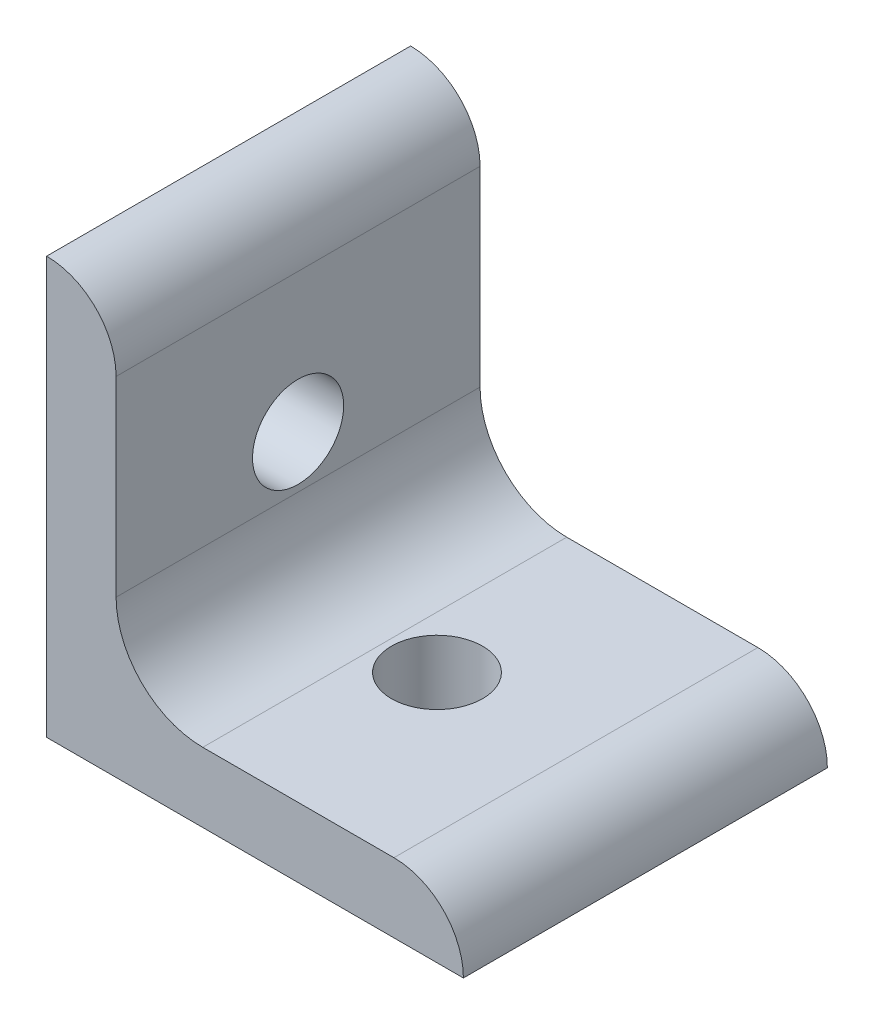
ISO-10303-21;
HEADER;
FILE_DESCRIPTION(('STEP AP214'),'2;1');
FILE_NAME('part.step','',(''),(''),'','','');
FILE_SCHEMA(('AUTOMOTIVE_DESIGN { 1 0 10303 214 1 1 1 1 }'));
ENDSEC;
DATA;
#1=APPLICATION_CONTEXT('core data for automotive mechanical design processes');
#2=APPLICATION_PROTOCOL_DEFINITION('international standard','automotive_design',2000,#1);
#3=PRODUCT_CONTEXT('',#1,'mechanical');
#4=PRODUCT('Part','Part','',(#3));
#5=PRODUCT_RELATED_PRODUCT_CATEGORY('part','',(#4));
#6=PRODUCT_DEFINITION_FORMATION('','',#4);
#7=PRODUCT_DEFINITION_CONTEXT('part definition',#1,'design');
#8=PRODUCT_DEFINITION('design','',#6,#7);
#9=PRODUCT_DEFINITION_SHAPE('','',#8);
#10=(LENGTH_UNIT() NAMED_UNIT(*) SI_UNIT(.MILLI.,.METRE.));
#11=(NAMED_UNIT(*) PLANE_ANGLE_UNIT() SI_UNIT($,.RADIAN.));
#12=(NAMED_UNIT(*) SI_UNIT($,.STERADIAN.) SOLID_ANGLE_UNIT());
#13=UNCERTAINTY_MEASURE_WITH_UNIT(LENGTH_MEASURE(1.E-05),#10,'distance_accuracy_value','');
#14=(GEOMETRIC_REPRESENTATION_CONTEXT(3) GLOBAL_UNCERTAINTY_ASSIGNED_CONTEXT((#13)) GLOBAL_UNIT_ASSIGNED_CONTEXT((#10,
#11,#12)) REPRESENTATION_CONTEXT('',''));
#15=CARTESIAN_POINT('',(0.,0.,0.));
#16=DIRECTION('',(0.,0.,1.));
#17=DIRECTION('',(1.,0.,0.));
#18=AXIS2_PLACEMENT_3D('',#15,#16,#17);
#19=CARTESIAN_POINT('',(-19.05,12.7,16.637));
#20=DIRECTION('',(0.,0.,-1.));
#21=DIRECTION('',(-1.,0.,0.));
#22=AXIS2_PLACEMENT_3D('',#19,#20,#21);
#23=CYLINDRICAL_SURFACE('',#22,6.35);
#24=DIRECTION('',(0.,0.,-1.));
#25=VECTOR('',#24,1.);
#26=CARTESIAN_POINT('',(-12.7,12.7,16.637));
#27=LINE('',#26,#25);
#28=CARTESIAN_POINT('',(-12.7,12.7,16.637));
#29=VERTEX_POINT('',#28);
#30=CARTESIAN_POINT('',(-12.7,12.7,-16.637));
#31=VERTEX_POINT('',#30);
#32=EDGE_CURVE('E110',#29,#31,#27,.T.);
#33=ORIENTED_EDGE('',*,*,#32,.T.);
#34=CARTESIAN_POINT('',(-19.05,12.7,-16.637));
#35=DIRECTION('',(0.,0.,1.));
#36=DIRECTION('',(1.,0.,0.));
#37=AXIS2_PLACEMENT_3D('',#34,#35,#36);
#38=CIRCLE('',#37,6.35);
#39=CARTESIAN_POINT('',(-19.05,19.05,-16.637));
#40=VERTEX_POINT('',#39);
#41=EDGE_CURVE('E104',#31,#40,#38,.T.);
#42=ORIENTED_EDGE('',*,*,#41,.T.);
#43=DIRECTION('',(0.,0.,-1.));
#44=VECTOR('',#43,1.);
#45=CARTESIAN_POINT('',(-19.05,19.05,16.637));
#46=LINE('',#45,#44);
#47=CARTESIAN_POINT('',(-19.05,19.05,16.637));
#48=VERTEX_POINT('',#47);
#49=EDGE_CURVE('E11',#48,#40,#46,.T.);
#50=ORIENTED_EDGE('',*,*,#49,.F.);
#51=CARTESIAN_POINT('',(-19.05,12.7,16.637));
#52=DIRECTION('',(0.,0.,1.));
#53=DIRECTION('',(1.,0.,0.));
#54=AXIS2_PLACEMENT_3D('',#51,#52,#53);
#55=CIRCLE('',#54,6.35);
#56=EDGE_CURVE('E130',#29,#48,#55,.T.);
#57=ORIENTED_EDGE('',*,*,#56,.F.);
#58=EDGE_LOOP('',(#33,#42,#50,#57));
#59=FACE_BOUND('',#58,.T.);
#60=ADVANCED_FACE('F32',(#59),#23,.T.);
#61=CARTESIAN_POINT('',(-19.05,19.05,16.637));
#62=DIRECTION('',(1.,0.,0.));
#63=DIRECTION('',(0.,1.,0.));
#64=AXIS2_PLACEMENT_3D('',#61,#62,#63);
#65=PLANE('',#64);
#66=CARTESIAN_POINT('',(-19.05,0.,0.));
#67=DIRECTION('',(1.,0.,0.));
#68=DIRECTION('',(0.,0.,-1.));
#69=AXIS2_PLACEMENT_3D('',#66,#67,#68);
#70=CIRCLE('',#69,4.1656);
#71=CARTESIAN_POINT('',(-19.05,0.,-4.1656));
#72=VERTEX_POINT('',#71);
#73=EDGE_CURVE('E213',#72,#72,#70,.T.);
#74=ORIENTED_EDGE('',*,*,#73,.T.);
#75=EDGE_LOOP('',(#74));
#76=FACE_BOUND('',#75,.T.);
#77=ORIENTED_EDGE('',*,*,#49,.T.);
#78=DIRECTION('',(0.,-1.,0.));
#79=VECTOR('',#78,1.);
#80=CARTESIAN_POINT('',(-19.05,19.05,-16.637));
#81=LINE('',#80,#79);
#82=CARTESIAN_POINT('',(-19.05,-19.05,-16.637));
#83=VERTEX_POINT('',#82);
#84=EDGE_CURVE('E94',#40,#83,#81,.T.);
#85=ORIENTED_EDGE('',*,*,#84,.T.);
#86=DIRECTION('',(0.,0.,-1.));
#87=VECTOR('',#86,1.);
#88=CARTESIAN_POINT('',(-19.05,-19.05,16.637));
#89=LINE('',#88,#87);
#90=CARTESIAN_POINT('',(-19.05,-19.05,16.637));
#91=VERTEX_POINT('',#90);
#92=EDGE_CURVE('E40',#91,#83,#89,.T.);
#93=ORIENTED_EDGE('',*,*,#92,.F.);
#94=DIRECTION('',(0.,-1.,0.));
#95=VECTOR('',#94,1.);
#96=CARTESIAN_POINT('',(-19.05,19.05,16.637));
#97=LINE('',#96,#95);
#98=EDGE_CURVE('E95',#48,#91,#97,.T.);
#99=ORIENTED_EDGE('',*,*,#98,.F.);
#100=EDGE_LOOP('',(#77,#85,#93,#99));
#101=FACE_BOUND('',#100,.T.);
#102=ADVANCED_FACE('F92',(#76,#101),#65,.F.);
#103=CARTESIAN_POINT('',(-19.05,-19.05,16.637));
#104=DIRECTION('',(0.,1.,0.));
#105=DIRECTION('',(0.,0.,1.));
#106=AXIS2_PLACEMENT_3D('',#103,#104,#105);
#107=PLANE('',#106);
#108=CARTESIAN_POINT('',(0.,-19.05,0.));
#109=DIRECTION('',(0.,1.,0.));
#110=DIRECTION('',(0.,0.,1.));
#111=AXIS2_PLACEMENT_3D('',#108,#109,#110);
#112=CIRCLE('',#111,4.1656);
#113=CARTESIAN_POINT('',(0.,-19.05,4.1656));
#114=VERTEX_POINT('',#113);
#115=EDGE_CURVE('E114',#114,#114,#112,.T.);
#116=ORIENTED_EDGE('',*,*,#115,.T.);
#117=EDGE_LOOP('',(#116));
#118=FACE_BOUND('',#117,.T.);
#119=ORIENTED_EDGE('',*,*,#92,.T.);
#120=DIRECTION('',(1.,0.,0.));
#121=VECTOR('',#120,1.);
#122=CARTESIAN_POINT('',(-19.05,-19.05,-16.637));
#123=LINE('',#122,#121);
#124=CARTESIAN_POINT('',(19.05,-19.05,-16.637));
#125=VERTEX_POINT('',#124);
#126=EDGE_CURVE('E108',#83,#125,#123,.T.);
#127=ORIENTED_EDGE('',*,*,#126,.T.);
#128=DIRECTION('',(0.,0.,-1.));
#129=VECTOR('',#128,1.);
#130=CARTESIAN_POINT('',(19.05,-19.05,16.637));
#131=LINE('',#130,#129);
#132=CARTESIAN_POINT('',(19.05,-19.05,16.637));
#133=VERTEX_POINT('',#132);
#134=EDGE_CURVE('E148',#133,#125,#131,.T.);
#135=ORIENTED_EDGE('',*,*,#134,.F.);
#136=DIRECTION('',(1.,0.,0.));
#137=VECTOR('',#136,1.);
#138=CARTESIAN_POINT('',(-19.05,-19.05,16.637));
#139=LINE('',#138,#137);
#140=EDGE_CURVE('E133',#91,#133,#139,.T.);
#141=ORIENTED_EDGE('',*,*,#140,.F.);
#142=EDGE_LOOP('',(#119,#127,#135,#141));
#143=FACE_BOUND('',#142,.T.);
#144=ADVANCED_FACE('F152',(#118,#143),#107,.F.);
#145=CARTESIAN_POINT('',(12.7,-19.05,16.637));
#146=DIRECTION('',(0.,0.,-1.));
#147=DIRECTION('',(-1.,0.,0.));
#148=AXIS2_PLACEMENT_3D('',#145,#146,#147);
#149=CYLINDRICAL_SURFACE('',#148,6.35);
#150=ORIENTED_EDGE('',*,*,#134,.T.);
#151=CARTESIAN_POINT('',(12.7,-19.05,-16.637));
#152=DIRECTION('',(0.,0.,1.));
#153=DIRECTION('',(-1.,0.,0.));
#154=AXIS2_PLACEMENT_3D('',#151,#152,#153);
#155=CIRCLE('',#154,6.35);
#156=CARTESIAN_POINT('',(12.7,-12.7,-16.637));
#157=VERTEX_POINT('',#156);
#158=EDGE_CURVE('E119',#125,#157,#155,.T.);
#159=ORIENTED_EDGE('',*,*,#158,.T.);
#160=DIRECTION('',(0.,0.,-1.));
#161=VECTOR('',#160,1.);
#162=CARTESIAN_POINT('',(12.7,-12.7,16.637));
#163=LINE('',#162,#161);
#164=CARTESIAN_POINT('',(12.7,-12.7,16.637));
#165=VERTEX_POINT('',#164);
#166=EDGE_CURVE('E146',#165,#157,#163,.T.);
#167=ORIENTED_EDGE('',*,*,#166,.F.);
#168=CARTESIAN_POINT('',(12.7,-19.05,16.637));
#169=DIRECTION('',(0.,0.,1.));
#170=DIRECTION('',(-1.,0.,0.));
#171=AXIS2_PLACEMENT_3D('',#168,#169,#170);
#172=CIRCLE('',#171,6.35);
#173=EDGE_CURVE('E135',#133,#165,#172,.T.);
#174=ORIENTED_EDGE('',*,*,#173,.F.);
#175=EDGE_LOOP('',(#150,#159,#167,#174));
#176=FACE_BOUND('',#175,.T.);
#177=ADVANCED_FACE('F160',(#176),#149,.T.);
#178=CARTESIAN_POINT('',(-4.77519999999995,-12.7,16.637));
#179=DIRECTION('',(0.,-1.,0.));
#180=DIRECTION('',(0.,0.,-1.));
#181=AXIS2_PLACEMENT_3D('',#178,#179,#180);
#182=PLANE('',#181);
#183=CARTESIAN_POINT('',(0.,-12.7,0.));
#184=DIRECTION('',(0.,-1.,0.));
#185=DIRECTION('',(0.,0.,-1.));
#186=AXIS2_PLACEMENT_3D('',#183,#184,#185);
#187=CIRCLE('',#186,4.1656);
#188=CARTESIAN_POINT('',(0.,-12.7,4.1656));
#189=VERTEX_POINT('',#188);
#190=EDGE_CURVE('E111',#189,#189,#187,.T.);
#191=ORIENTED_EDGE('',*,*,#190,.T.);
#192=EDGE_LOOP('',(#191));
#193=FACE_BOUND('',#192,.T.);
#194=ORIENTED_EDGE('',*,*,#166,.T.);
#195=DIRECTION('',(-1.,0.,0.));
#196=VECTOR('',#195,1.);
#197=CARTESIAN_POINT('',(-4.77519999999995,-12.7,-16.637));
#198=LINE('',#197,#196);
#199=CARTESIAN_POINT('',(-4.77519999999995,-12.7,-16.637));
#200=VERTEX_POINT('',#199);
#201=EDGE_CURVE('E122',#157,#200,#198,.T.);
#202=ORIENTED_EDGE('',*,*,#201,.T.);
#203=DIRECTION('',(0.,0.,-1.));
#204=VECTOR('',#203,1.);
#205=CARTESIAN_POINT('',(-4.77519999999995,-12.7,16.637));
#206=LINE('',#205,#204);
#207=CARTESIAN_POINT('',(-4.77519999999995,-12.7,16.637));
#208=VERTEX_POINT('',#207);
#209=EDGE_CURVE('E144',#208,#200,#206,.T.);
#210=ORIENTED_EDGE('',*,*,#209,.F.);
#211=DIRECTION('',(-1.,0.,0.));
#212=VECTOR('',#211,1.);
#213=CARTESIAN_POINT('',(-4.77519999999995,-12.7,16.637));
#214=LINE('',#213,#212);
#215=EDGE_CURVE('E137',#165,#208,#214,.T.);
#216=ORIENTED_EDGE('',*,*,#215,.F.);
#217=EDGE_LOOP('',(#194,#202,#210,#216));
#218=FACE_BOUND('',#217,.T.);
#219=ADVANCED_FACE('F163',(#193,#218),#182,.F.);
#220=CARTESIAN_POINT('',(-4.7752,-4.7752,16.637));
#221=DIRECTION('',(0.,0.,-1.));
#222=DIRECTION('',(-1.,0.,0.));
#223=AXIS2_PLACEMENT_3D('',#220,#221,#222);
#224=CYLINDRICAL_SURFACE('',#223,7.9248);
#225=ORIENTED_EDGE('',*,*,#209,.T.);
#226=CARTESIAN_POINT('',(-4.7752,-4.7752,-16.637));
#227=DIRECTION('',(0.,0.,-1.));
#228=DIRECTION('',(1.,0.,0.));
#229=AXIS2_PLACEMENT_3D('',#226,#227,#228);
#230=CIRCLE('',#229,7.9248);
#231=CARTESIAN_POINT('',(-12.7,-4.77519999999994,-16.637));
#232=VERTEX_POINT('',#231);
#233=EDGE_CURVE('E125',#200,#232,#230,.T.);
#234=ORIENTED_EDGE('',*,*,#233,.T.);
#235=DIRECTION('',(0.,0.,-1.));
#236=VECTOR('',#235,1.);
#237=CARTESIAN_POINT('',(-12.7,-4.77519999999994,16.637));
#238=LINE('',#237,#236);
#239=CARTESIAN_POINT('',(-12.7,-4.77519999999994,16.637));
#240=VERTEX_POINT('',#239);
#241=EDGE_CURVE('E142',#240,#232,#238,.T.);
#242=ORIENTED_EDGE('',*,*,#241,.F.);
#243=CARTESIAN_POINT('',(-4.7752,-4.7752,16.637));
#244=DIRECTION('',(0.,0.,-1.));
#245=DIRECTION('',(1.,0.,0.));
#246=AXIS2_PLACEMENT_3D('',#243,#244,#245);
#247=CIRCLE('',#246,7.9248);
#248=EDGE_CURVE('E53',#208,#240,#247,.T.);
#249=ORIENTED_EDGE('',*,*,#248,.F.);
#250=EDGE_LOOP('',(#225,#234,#242,#249));
#251=FACE_BOUND('',#250,.T.);
#252=ADVANCED_FACE('F166',(#251),#224,.F.);
#253=CARTESIAN_POINT('',(-12.7,12.7,16.637));
#254=DIRECTION('',(-1.,0.,0.));
#255=DIRECTION('',(0.,-1.,0.));
#256=AXIS2_PLACEMENT_3D('',#253,#254,#255);
#257=PLANE('',#256);
#258=CARTESIAN_POINT('',(-12.7,0.,0.));
#259=DIRECTION('',(-1.,0.,0.));
#260=DIRECTION('',(0.,-1.,0.));
#261=AXIS2_PLACEMENT_3D('',#258,#259,#260);
#262=CIRCLE('',#261,4.1656);
#263=CARTESIAN_POINT('',(-12.7,-4.1656,0.));
#264=VERTEX_POINT('',#263);
#265=EDGE_CURVE('E35',#264,#264,#262,.T.);
#266=ORIENTED_EDGE('',*,*,#265,.T.);
#267=EDGE_LOOP('',(#266));
#268=FACE_BOUND('',#267,.T.);
#269=ORIENTED_EDGE('',*,*,#241,.T.);
#270=DIRECTION('',(0.,1.,0.));
#271=VECTOR('',#270,1.);
#272=CARTESIAN_POINT('',(-12.7,12.7,-16.637));
#273=LINE('',#272,#271);
#274=EDGE_CURVE('E128',#232,#31,#273,.T.);
#275=ORIENTED_EDGE('',*,*,#274,.T.);
#276=ORIENTED_EDGE('',*,*,#32,.F.);
#277=DIRECTION('',(0.,1.,0.));
#278=VECTOR('',#277,1.);
#279=CARTESIAN_POINT('',(-12.7,12.7,16.637));
#280=LINE('',#279,#278);
#281=EDGE_CURVE('E48',#240,#29,#280,.T.);
#282=ORIENTED_EDGE('',*,*,#281,.F.);
#283=EDGE_LOOP('',(#269,#275,#276,#282));
#284=FACE_BOUND('',#283,.T.);
#285=ADVANCED_FACE('F168',(#268,#284),#257,.F.);
#286=CARTESIAN_POINT('',(-19.05,12.7,16.637));
#287=DIRECTION('',(0.,0.,1.));
#288=DIRECTION('',(1.,0.,0.));
#289=AXIS2_PLACEMENT_3D('',#286,#287,#288);
#290=PLANE('',#289);
#291=ORIENTED_EDGE('',*,*,#56,.T.);
#292=ORIENTED_EDGE('',*,*,#98,.T.);
#293=ORIENTED_EDGE('',*,*,#140,.T.);
#294=ORIENTED_EDGE('',*,*,#173,.T.);
#295=ORIENTED_EDGE('',*,*,#215,.T.);
#296=ORIENTED_EDGE('',*,*,#248,.T.);
#297=ORIENTED_EDGE('',*,*,#281,.T.);
#298=EDGE_LOOP('',(#291,#292,#293,#294,#295,#296,#297));
#299=FACE_BOUND('',#298,.T.);
#300=ADVANCED_FACE('F155',(#299),#290,.T.);
#301=CARTESIAN_POINT('',(-19.05,12.7,-16.637));
#302=DIRECTION('',(0.,0.,1.));
#303=DIRECTION('',(1.,0.,0.));
#304=AXIS2_PLACEMENT_3D('',#301,#302,#303);
#305=PLANE('',#304);
#306=ORIENTED_EDGE('',*,*,#41,.F.);
#307=ORIENTED_EDGE('',*,*,#274,.F.);
#308=ORIENTED_EDGE('',*,*,#233,.F.);
#309=ORIENTED_EDGE('',*,*,#201,.F.);
#310=ORIENTED_EDGE('',*,*,#158,.F.);
#311=ORIENTED_EDGE('',*,*,#126,.F.);
#312=ORIENTED_EDGE('',*,*,#84,.F.);
#313=EDGE_LOOP('',(#306,#307,#308,#309,#310,#311,#312));
#314=FACE_BOUND('',#313,.T.);
#315=ADVANCED_FACE('F102',(#314),#305,.F.);
#316=CARTESIAN_POINT('',(0.,-19.05,0.));
#317=DIRECTION('',(0.,1.,0.));
#318=DIRECTION('',(0.,0.,1.));
#319=AXIS2_PLACEMENT_3D('',#316,#317,#318);
#320=CYLINDRICAL_SURFACE('',#319,4.1656);
#321=CARTESIAN_POINT('',(0.,-19.05,4.1656));
#322=CARTESIAN_POINT('',(0.,-18.9838541666667,4.1656));
#323=CARTESIAN_POINT('',(0.,-18.9177083333333,4.1656));
#324=CARTESIAN_POINT('',(0.,-18.7854166666667,4.1656));
#325=CARTESIAN_POINT('',(0.,-18.7192708333333,4.1656));
#326=CARTESIAN_POINT('',(0.,-18.5869791666667,4.1656));
#327=CARTESIAN_POINT('',(0.,-18.5208333333333,4.1656));
#328=CARTESIAN_POINT('',(0.,-18.3885416666667,4.1656));
#329=CARTESIAN_POINT('',(0.,-18.3223958333333,4.1656));
#330=CARTESIAN_POINT('',(0.,-18.1901041666667,4.1656));
#331=CARTESIAN_POINT('',(0.,-18.1239583333333,4.1656));
#332=CARTESIAN_POINT('',(0.,-17.9916666666667,4.1656));
#333=CARTESIAN_POINT('',(0.,-17.9255208333333,4.1656));
#334=CARTESIAN_POINT('',(0.,-17.7932291666667,4.1656));
#335=CARTESIAN_POINT('',(0.,-17.7270833333333,4.1656));
#336=CARTESIAN_POINT('',(0.,-17.5947916666667,4.1656));
#337=CARTESIAN_POINT('',(0.,-17.5286458333333,4.1656));
#338=CARTESIAN_POINT('',(0.,-17.3963541666667,4.1656));
#339=CARTESIAN_POINT('',(0.,-17.3302083333333,4.1656));
#340=CARTESIAN_POINT('',(0.,-17.1979166666667,4.1656));
#341=CARTESIAN_POINT('',(0.,-17.1317708333333,4.1656));
#342=CARTESIAN_POINT('',(0.,-16.9994791666667,4.1656));
#343=CARTESIAN_POINT('',(0.,-16.9333333333333,4.1656));
#344=CARTESIAN_POINT('',(0.,-16.8010416666667,4.1656));
#345=CARTESIAN_POINT('',(0.,-16.7348958333333,4.1656));
#346=CARTESIAN_POINT('',(0.,-16.6026041666667,4.1656));
#347=CARTESIAN_POINT('',(0.,-16.5364583333333,4.1656));
#348=CARTESIAN_POINT('',(0.,-16.4041666666667,4.1656));
#349=CARTESIAN_POINT('',(0.,-16.3380208333333,4.1656));
#350=CARTESIAN_POINT('',(0.,-16.2057291666667,4.1656));
#351=CARTESIAN_POINT('',(0.,-16.1395833333333,4.1656));
#352=CARTESIAN_POINT('',(0.,-16.0072916666667,4.1656));
#353=CARTESIAN_POINT('',(0.,-15.9411458333333,4.1656));
#354=CARTESIAN_POINT('',(0.,-15.8088541666667,4.1656));
#355=CARTESIAN_POINT('',(0.,-15.7427083333333,4.1656));
#356=CARTESIAN_POINT('',(0.,-15.6104166666667,4.1656));
#357=CARTESIAN_POINT('',(0.,-15.5442708333333,4.1656));
#358=CARTESIAN_POINT('',(0.,-15.4119791666667,4.1656));
#359=CARTESIAN_POINT('',(0.,-15.3458333333333,4.1656));
#360=CARTESIAN_POINT('',(0.,-15.2135416666667,4.1656));
#361=CARTESIAN_POINT('',(0.,-15.1473958333333,4.1656));
#362=CARTESIAN_POINT('',(0.,-15.0151041666667,4.1656));
#363=CARTESIAN_POINT('',(0.,-14.9489583333333,4.1656));
#364=CARTESIAN_POINT('',(0.,-14.8166666666667,4.1656));
#365=CARTESIAN_POINT('',(0.,-14.7505208333333,4.1656));
#366=CARTESIAN_POINT('',(0.,-14.6182291666667,4.1656));
#367=CARTESIAN_POINT('',(0.,-14.5520833333333,4.1656));
#368=CARTESIAN_POINT('',(0.,-14.4197916666667,4.1656));
#369=CARTESIAN_POINT('',(0.,-14.3536458333333,4.1656));
#370=CARTESIAN_POINT('',(0.,-14.2213541666667,4.1656));
#371=CARTESIAN_POINT('',(0.,-14.1552083333333,4.1656));
#372=CARTESIAN_POINT('',(0.,-14.0229166666667,4.1656));
#373=CARTESIAN_POINT('',(0.,-13.9567708333333,4.1656));
#374=CARTESIAN_POINT('',(0.,-13.8244791666667,4.1656));
#375=CARTESIAN_POINT('',(0.,-13.7583333333333,4.1656));
#376=CARTESIAN_POINT('',(0.,-13.6260416666667,4.1656));
#377=CARTESIAN_POINT('',(0.,-13.5598958333333,4.1656));
#378=CARTESIAN_POINT('',(0.,-13.4276041666667,4.1656));
#379=CARTESIAN_POINT('',(0.,-13.3614583333333,4.1656));
#380=CARTESIAN_POINT('',(0.,-13.2291666666667,4.1656));
#381=CARTESIAN_POINT('',(0.,-13.1630208333333,4.1656));
#382=CARTESIAN_POINT('',(0.,-13.0307291666667,4.1656));
#383=CARTESIAN_POINT('',(0.,-12.9645833333333,4.1656));
#384=CARTESIAN_POINT('',(0.,-12.8322916666667,4.1656));
#385=CARTESIAN_POINT('',(0.,-12.7661458333333,4.1656));
#386=CARTESIAN_POINT('',(0.,-12.7,4.1656));
#387=B_SPLINE_CURVE_WITH_KNOTS('',3,(#321,#322,#323,#324,#325,#326,#327,#328,#329,#330,#331,
#332,#333,#334,#335,#336,#337,#338,#339,#340,#341,#342,#343,#344,#345,#346,#347,#348,#349,#350,
#351,#352,#353,#354,#355,#356,#357,#358,#359,#360,#361,#362,#363,#364,#365,#366,#367,#368,#369,
#370,#371,#372,#373,#374,#375,#376,#377,#378,#379,#380,#381,#382,#383,#384,#385,#386),
.UNSPECIFIED.,.F.,.F.,(4,2,2,2,2,2,2,2,2,2,2,2,2,2,2,2,2,2,2,2,2,2,2,2,2,2,2,2,2,2,2,2,4),(0.,
0.198437499999999,0.396874999999998,0.595312499999997,0.793749999999999,0.992187499999998,
1.190625,1.3890625,1.5875,1.7859375,1.984375,2.1828125,2.38125,2.5796875,2.778125,2.9765625,
3.175,3.3734375,3.571875,3.7703125,3.96875,4.1671875,4.365625,4.5640625,4.7625,4.9609375,
5.159375,5.3578125,5.55625,5.7546875,5.953125,6.1515625,6.35),.UNSPECIFIED.);
#388=EDGE_CURVE('BSEAM199',#114,#189,#387,.T.);
#389=ORIENTED_EDGE('',*,*,#115,.F.);
#390=ORIENTED_EDGE('',*,*,#190,.F.);
#391=ORIENTED_EDGE('',*,*,#388,.T.);
#392=ORIENTED_EDGE('',*,*,#388,.F.);
#393=EDGE_LOOP('',(#389,#391,#390,#392));
#394=FACE_BOUND('',#393,.T.);
#395=ADVANCED_FACE('F199',(#394),#320,.F.);
#396=CARTESIAN_POINT('',(-19.05,0.,0.));
#397=DIRECTION('',(1.,0.,0.));
#398=DIRECTION('',(0.,0.,-1.));
#399=AXIS2_PLACEMENT_3D('',#396,#397,#398);
#400=CYLINDRICAL_SURFACE('',#399,4.1656);
#401=ORIENTED_EDGE('',*,*,#73,.F.);
#402=EDGE_LOOP('',(#401));
#403=FACE_BOUND('',#402,.T.);
#404=ORIENTED_EDGE('',*,*,#265,.F.);
#405=EDGE_LOOP('',(#404));
#406=FACE_BOUND('',#405,.T.);
#407=ADVANCED_FACE('F201',(#403,#406),#400,.F.);
#408=CLOSED_SHELL('',(#60,#102,#144,#177,#219,#252,#285,#300,#315,#395,#407));
#409=MANIFOLD_SOLID_BREP('B2',#408);
#410=ADVANCED_BREP_SHAPE_REPRESENTATION('',(#18,#409),#14);
#411=SHAPE_DEFINITION_REPRESENTATION(#9,#410);
ENDSEC;
END-ISO-10303-21;
